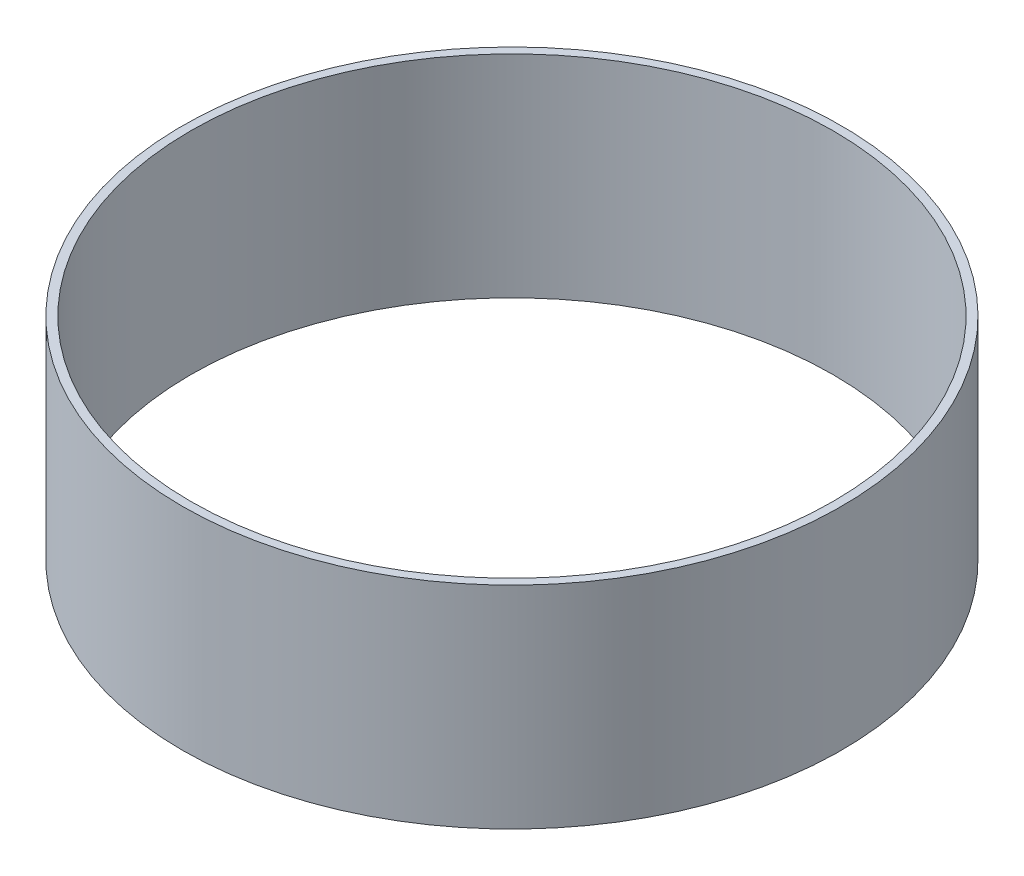
ISO-10303-21;
HEADER;
FILE_DESCRIPTION(('STEP AP214'),'2;1');
FILE_NAME('part.step','',(''),(''),'','','');
FILE_SCHEMA(('AUTOMOTIVE_DESIGN { 1 0 10303 214 1 1 1 1 }'));
ENDSEC;
DATA;
#1=APPLICATION_CONTEXT('core data for automotive mechanical design processes');
#2=APPLICATION_PROTOCOL_DEFINITION('international standard','automotive_design',2000,#1);
#3=PRODUCT_CONTEXT('',#1,'mechanical');
#4=PRODUCT('Part','Part','',(#3));
#5=PRODUCT_RELATED_PRODUCT_CATEGORY('part','',(#4));
#6=PRODUCT_DEFINITION_FORMATION('','',#4);
#7=PRODUCT_DEFINITION_CONTEXT('part definition',#1,'design');
#8=PRODUCT_DEFINITION('design','',#6,#7);
#9=PRODUCT_DEFINITION_SHAPE('','',#8);
#10=(LENGTH_UNIT() NAMED_UNIT(*) SI_UNIT(.MILLI.,.METRE.));
#11=(NAMED_UNIT(*) PLANE_ANGLE_UNIT() SI_UNIT($,.RADIAN.));
#12=(NAMED_UNIT(*) SI_UNIT($,.STERADIAN.) SOLID_ANGLE_UNIT());
#13=UNCERTAINTY_MEASURE_WITH_UNIT(LENGTH_MEASURE(1.E-05),#10,'distance_accuracy_value','');
#14=(GEOMETRIC_REPRESENTATION_CONTEXT(3) GLOBAL_UNCERTAINTY_ASSIGNED_CONTEXT((#13)) GLOBAL_UNIT_ASSIGNED_CONTEXT((#10,
#11,#12)) REPRESENTATION_CONTEXT('',''));
#15=CARTESIAN_POINT('',(0.,0.,0.));
#16=DIRECTION('',(0.,0.,1.));
#17=DIRECTION('',(1.,0.,0.));
#18=AXIS2_PLACEMENT_3D('',#15,#16,#17);
#19=CARTESIAN_POINT('',(0.,-25.,0.));
#20=DIRECTION('',(0.,1.,0.));
#21=DIRECTION('',(0.,0.,1.));
#22=AXIS2_PLACEMENT_3D('',#19,#20,#21);
#23=CYLINDRICAL_SURFACE('',#22,78.);
#24=CARTESIAN_POINT('',(0.,-25.,0.));
#25=DIRECTION('',(0.,1.,0.));
#26=DIRECTION('',(0.,0.,1.));
#27=AXIS2_PLACEMENT_3D('',#24,#25,#26);
#28=CIRCLE('',#27,78.);
#29=CARTESIAN_POINT('',(0.,-25.,78.));
#30=VERTEX_POINT('',#29);
#31=EDGE_CURVE('E10',#30,#30,#28,.T.);
#32=ORIENTED_EDGE('',*,*,#31,.T.);
#33=EDGE_LOOP('',(#32));
#34=FACE_BOUND('',#33,.T.);
#35=CARTESIAN_POINT('',(0.,25.,0.));
#36=DIRECTION('',(0.,1.,0.));
#37=DIRECTION('',(0.,0.,1.));
#38=AXIS2_PLACEMENT_3D('',#35,#36,#37);
#39=CIRCLE('',#38,78.);
#40=CARTESIAN_POINT('',(0.,25.,78.));
#41=VERTEX_POINT('',#40);
#42=EDGE_CURVE('E42',#41,#41,#39,.T.);
#43=ORIENTED_EDGE('',*,*,#42,.F.);
#44=EDGE_LOOP('',(#43));
#45=FACE_BOUND('',#44,.T.);
#46=ADVANCED_FACE('F32',(#34,#45),#23,.T.);
#47=CARTESIAN_POINT('',(0.,-25.,0.));
#48=DIRECTION('',(0.,1.,0.));
#49=DIRECTION('',(0.,0.,1.));
#50=AXIS2_PLACEMENT_3D('',#47,#48,#49);
#51=PLANE('',#50);
#52=CARTESIAN_POINT('',(0.,-25.,0.));
#53=DIRECTION('',(0.,1.,0.));
#54=DIRECTION('',(0.,0.,1.));
#55=AXIS2_PLACEMENT_3D('',#52,#53,#54);
#56=CIRCLE('',#55,76.);
#57=CARTESIAN_POINT('',(0.,-25.,76.));
#58=VERTEX_POINT('',#57);
#59=EDGE_CURVE('E38',#58,#58,#56,.T.);
#60=ORIENTED_EDGE('',*,*,#59,.T.);
#61=EDGE_LOOP('',(#60));
#62=FACE_BOUND('',#61,.T.);
#63=ORIENTED_EDGE('',*,*,#31,.F.);
#64=EDGE_LOOP('',(#63));
#65=FACE_BOUND('',#64,.T.);
#66=ADVANCED_FACE('F61',(#62,#65),#51,.F.);
#67=CARTESIAN_POINT('',(0.,-25.,0.));
#68=DIRECTION('',(0.,1.,0.));
#69=DIRECTION('',(0.,0.,1.));
#70=AXIS2_PLACEMENT_3D('',#67,#68,#69);
#71=CYLINDRICAL_SURFACE('',#70,76.);
#72=ORIENTED_EDGE('',*,*,#59,.F.);
#73=EDGE_LOOP('',(#72));
#74=FACE_BOUND('',#73,.T.);
#75=CARTESIAN_POINT('',(0.,25.,0.));
#76=DIRECTION('',(0.,1.,0.));
#77=DIRECTION('',(0.,0.,1.));
#78=AXIS2_PLACEMENT_3D('',#75,#76,#77);
#79=CIRCLE('',#78,76.);
#80=CARTESIAN_POINT('',(0.,25.,76.));
#81=VERTEX_POINT('',#80);
#82=EDGE_CURVE('E46',#81,#81,#79,.T.);
#83=ORIENTED_EDGE('',*,*,#82,.T.);
#84=EDGE_LOOP('',(#83));
#85=FACE_BOUND('',#84,.T.);
#86=ADVANCED_FACE('F52',(#74,#85),#71,.F.);
#87=CARTESIAN_POINT('',(0.,25.,0.));
#88=DIRECTION('',(0.,1.,0.));
#89=DIRECTION('',(0.,0.,1.));
#90=AXIS2_PLACEMENT_3D('',#87,#88,#89);
#91=PLANE('',#90);
#92=ORIENTED_EDGE('',*,*,#42,.T.);
#93=EDGE_LOOP('',(#92));
#94=FACE_BOUND('',#93,.T.);
#95=ORIENTED_EDGE('',*,*,#82,.F.);
#96=EDGE_LOOP('',(#95));
#97=FACE_BOUND('',#96,.T.);
#98=ADVANCED_FACE('F54',(#94,#97),#91,.T.);
#99=CLOSED_SHELL('',(#46,#66,#86,#98));
#100=MANIFOLD_SOLID_BREP('B2',#99);
#101=ADVANCED_BREP_SHAPE_REPRESENTATION('',(#18,#100),#14);
#102=SHAPE_DEFINITION_REPRESENTATION(#9,#101);
ENDSEC;
END-ISO-10303-21;
